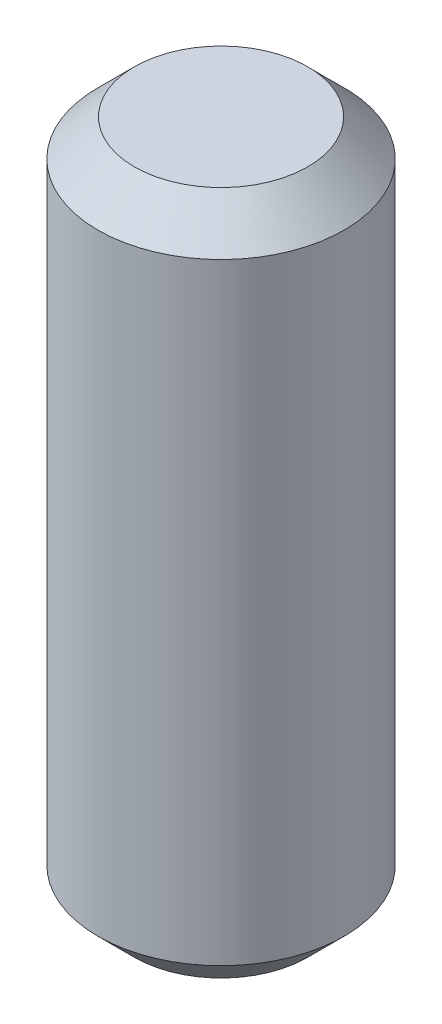
ISO-10303-21;
HEADER;
FILE_DESCRIPTION(('STEP AP214'),'2;1');
FILE_NAME('part.step','',(''),(''),'','','');
FILE_SCHEMA(('AUTOMOTIVE_DESIGN { 1 0 10303 214 1 1 1 1 }'));
ENDSEC;
DATA;
#1=APPLICATION_CONTEXT('core data for automotive mechanical design processes');
#2=APPLICATION_PROTOCOL_DEFINITION('international standard','automotive_design',2000,#1);
#3=PRODUCT_CONTEXT('',#1,'mechanical');
#4=PRODUCT('Part','Part','',(#3));
#5=PRODUCT_RELATED_PRODUCT_CATEGORY('part','',(#4));
#6=PRODUCT_DEFINITION_FORMATION('','',#4);
#7=PRODUCT_DEFINITION_CONTEXT('part definition',#1,'design');
#8=PRODUCT_DEFINITION('design','',#6,#7);
#9=PRODUCT_DEFINITION_SHAPE('','',#8);
#10=(LENGTH_UNIT() NAMED_UNIT(*) SI_UNIT(.MILLI.,.METRE.));
#11=(NAMED_UNIT(*) PLANE_ANGLE_UNIT() SI_UNIT($,.RADIAN.));
#12=(NAMED_UNIT(*) SI_UNIT($,.STERADIAN.) SOLID_ANGLE_UNIT());
#13=UNCERTAINTY_MEASURE_WITH_UNIT(LENGTH_MEASURE(1.E-05),#10,'distance_accuracy_value','');
#14=(GEOMETRIC_REPRESENTATION_CONTEXT(3) GLOBAL_UNCERTAINTY_ASSIGNED_CONTEXT((#13)) GLOBAL_UNIT_ASSIGNED_CONTEXT((#10,
#11,#12)) REPRESENTATION_CONTEXT('',''));
#15=CARTESIAN_POINT('',(0.,0.,0.));
#16=DIRECTION('',(0.,0.,1.));
#17=DIRECTION('',(1.,0.,0.));
#18=AXIS2_PLACEMENT_3D('',#15,#16,#17);
#19=CARTESIAN_POINT('',(0.,15.,0.));
#20=DIRECTION('',(0.,-1.,0.));
#21=DIRECTION('',(0.,0.,-1.));
#22=AXIS2_PLACEMENT_3D('',#19,#20,#21);
#23=CYLINDRICAL_SURFACE('',#22,2.7);
#24=CARTESIAN_POINT('',(0.,0.8,0.));
#25=DIRECTION('',(0.,1.,0.));
#26=DIRECTION('',(0.,0.,1.));
#27=AXIS2_PLACEMENT_3D('',#24,#25,#26);
#28=CIRCLE('',#27,2.7);
#29=CARTESIAN_POINT('',(0.,0.8,2.7));
#30=VERTEX_POINT('',#29);
#31=EDGE_CURVE('E53',#30,#30,#28,.T.);
#32=ORIENTED_EDGE('',*,*,#31,.T.);
#33=EDGE_LOOP('',(#32));
#34=FACE_BOUND('',#33,.T.);
#35=CARTESIAN_POINT('',(0.,14.2,0.));
#36=DIRECTION('',(0.,1.,0.));
#37=DIRECTION('',(0.,0.,1.));
#38=AXIS2_PLACEMENT_3D('',#35,#36,#37);
#39=CIRCLE('',#38,2.7);
#40=CARTESIAN_POINT('',(0.,14.2,2.7));
#41=VERTEX_POINT('',#40);
#42=EDGE_CURVE('E57',#41,#41,#39,.F.);
#43=ORIENTED_EDGE('',*,*,#42,.T.);
#44=EDGE_LOOP('',(#43));
#45=FACE_BOUND('',#44,.T.);
#46=ADVANCED_FACE('F41',(#34,#45),#23,.T.);
#47=CARTESIAN_POINT('',(0.,15.,0.));
#48=DIRECTION('',(0.,1.,0.));
#49=DIRECTION('',(0.,0.,1.));
#50=AXIS2_PLACEMENT_3D('',#47,#48,#49);
#51=PLANE('',#50);
#52=CARTESIAN_POINT('',(0.,15.,0.));
#53=DIRECTION('',(0.,1.,0.));
#54=DIRECTION('',(0.,0.,1.));
#55=AXIS2_PLACEMENT_3D('',#52,#53,#54);
#56=CIRCLE('',#55,1.9);
#57=CARTESIAN_POINT('',(0.,15.,1.9));
#58=VERTEX_POINT('',#57);
#59=EDGE_CURVE('E10',#58,#58,#56,.T.);
#60=ORIENTED_EDGE('',*,*,#59,.T.);
#61=EDGE_LOOP('',(#60));
#62=FACE_BOUND('',#61,.T.);
#63=ADVANCED_FACE('F73',(#62),#51,.T.);
#64=CARTESIAN_POINT('',(0.,0.,0.));
#65=DIRECTION('',(0.,1.,0.));
#66=DIRECTION('',(0.,0.,1.));
#67=AXIS2_PLACEMENT_3D('',#64,#65,#66);
#68=PLANE('',#67);
#69=CARTESIAN_POINT('',(0.,0.,0.));
#70=DIRECTION('',(0.,1.,0.));
#71=DIRECTION('',(0.,0.,1.));
#72=AXIS2_PLACEMENT_3D('',#69,#70,#71);
#73=CIRCLE('',#72,1.9);
#74=CARTESIAN_POINT('',(0.,0.,1.9));
#75=VERTEX_POINT('',#74);
#76=EDGE_CURVE('E49',#75,#75,#73,.F.);
#77=ORIENTED_EDGE('',*,*,#76,.T.);
#78=EDGE_LOOP('',(#77));
#79=FACE_BOUND('',#78,.T.);
#80=ADVANCED_FACE('F70',(#79),#68,.F.);
#81=CARTESIAN_POINT('',(0.,0.8,0.));
#82=DIRECTION('',(0.,1.,0.));
#83=DIRECTION('',(0.,0.,1.));
#84=AXIS2_PLACEMENT_3D('',#81,#82,#83);
#85=CONICAL_SURFACE('',#84,2.7,0.785398163397449);
#86=ORIENTED_EDGE('',*,*,#76,.F.);
#87=EDGE_LOOP('',(#86));
#88=FACE_BOUND('',#87,.T.);
#89=ORIENTED_EDGE('',*,*,#31,.F.);
#90=EDGE_LOOP('',(#89));
#91=FACE_BOUND('',#90,.T.);
#92=ADVANCED_FACE('F66',(#88,#91),#85,.T.);
#93=CARTESIAN_POINT('',(0.,15.,0.));
#94=DIRECTION('',(0.,-1.,0.));
#95=DIRECTION('',(0.,0.,-1.));
#96=AXIS2_PLACEMENT_3D('',#93,#94,#95);
#97=CONICAL_SURFACE('',#96,1.9,0.785398163397449);
#98=ORIENTED_EDGE('',*,*,#42,.F.);
#99=EDGE_LOOP('',(#98));
#100=FACE_BOUND('',#99,.T.);
#101=ORIENTED_EDGE('',*,*,#59,.F.);
#102=EDGE_LOOP('',(#101));
#103=FACE_BOUND('',#102,.T.);
#104=ADVANCED_FACE('F44',(#100,#103),#97,.T.);
#105=CLOSED_SHELL('',(#46,#63,#80,#92,#104));
#106=MANIFOLD_SOLID_BREP('B2',#105);
#107=ADVANCED_BREP_SHAPE_REPRESENTATION('',(#18,#106),#14);
#108=SHAPE_DEFINITION_REPRESENTATION(#9,#107);
ENDSEC;
END-ISO-10303-21;
